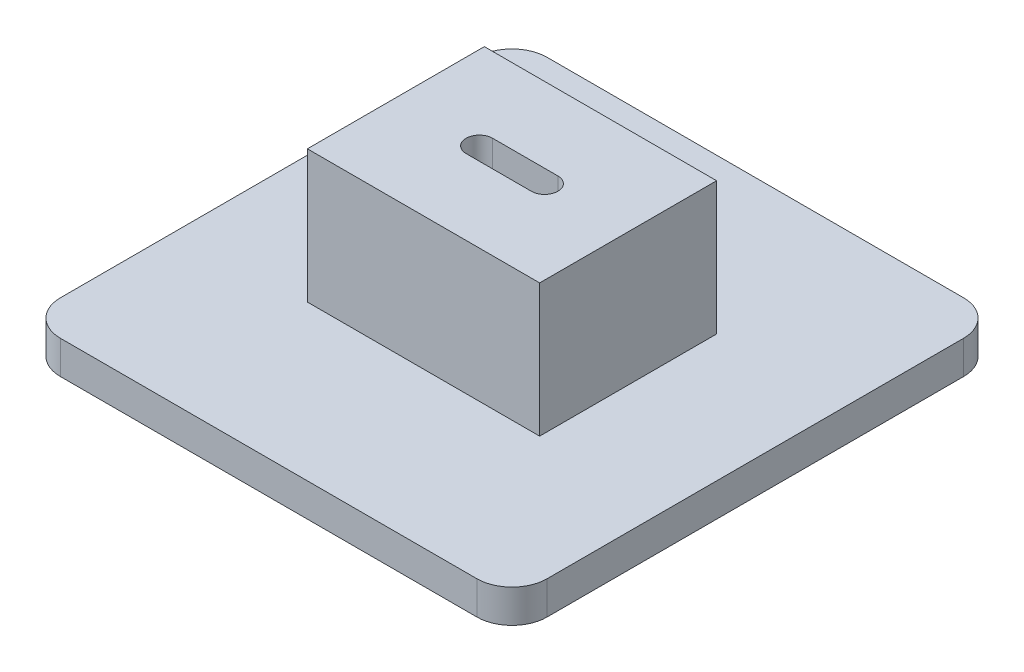
ISO-10303-21;
HEADER;
FILE_DESCRIPTION(('STEP AP214'),'2;1');
FILE_NAME('part.step','',(''),(''),'','','');
FILE_SCHEMA(('AUTOMOTIVE_DESIGN { 1 0 10303 214 1 1 1 1 }'));
ENDSEC;
DATA;
#1=APPLICATION_CONTEXT('core data for automotive mechanical design processes');
#2=APPLICATION_PROTOCOL_DEFINITION('international standard','automotive_design',2000,#1);
#3=PRODUCT_CONTEXT('',#1,'mechanical');
#4=PRODUCT('Part','Part','',(#3));
#5=PRODUCT_RELATED_PRODUCT_CATEGORY('part','',(#4));
#6=PRODUCT_DEFINITION_FORMATION('','',#4);
#7=PRODUCT_DEFINITION_CONTEXT('part definition',#1,'design');
#8=PRODUCT_DEFINITION('design','',#6,#7);
#9=PRODUCT_DEFINITION_SHAPE('','',#8);
#10=(LENGTH_UNIT() NAMED_UNIT(*) SI_UNIT(.MILLI.,.METRE.));
#11=(NAMED_UNIT(*) PLANE_ANGLE_UNIT() SI_UNIT($,.RADIAN.));
#12=(NAMED_UNIT(*) SI_UNIT($,.STERADIAN.) SOLID_ANGLE_UNIT());
#13=UNCERTAINTY_MEASURE_WITH_UNIT(LENGTH_MEASURE(1.E-05),#10,'distance_accuracy_value','');
#14=(GEOMETRIC_REPRESENTATION_CONTEXT(3) GLOBAL_UNCERTAINTY_ASSIGNED_CONTEXT((#13)) GLOBAL_UNIT_ASSIGNED_CONTEXT((#10,
#11,#12)) REPRESENTATION_CONTEXT('',''));
#15=CARTESIAN_POINT('',(0.,0.,0.));
#16=DIRECTION('',(0.,0.,1.));
#17=DIRECTION('',(1.,0.,0.));
#18=AXIS2_PLACEMENT_3D('',#15,#16,#17);
#19=CARTESIAN_POINT('',(0.,12.,0.));
#20=DIRECTION('',(0.,-1.,0.));
#21=DIRECTION('',(0.,0.,-1.));
#22=AXIS2_PLACEMENT_3D('',#19,#20,#21);
#23=PLANE('',#22);
#24=DIRECTION('',(0.,0.,-1.));
#25=VECTOR('',#24,1.);
#26=CARTESIAN_POINT('',(14.5,12.,-17.));
#27=LINE('',#26,#25);
#28=CARTESIAN_POINT('',(14.5,12.,-17.));
#29=VERTEX_POINT('',#28);
#30=CARTESIAN_POINT('',(14.5,12.,-27.));
#31=VERTEX_POINT('',#30);
#32=EDGE_CURVE('E229',#29,#31,#27,.T.);
#33=ORIENTED_EDGE('',*,*,#32,.T.);
#34=DIRECTION('',(1.,0.,0.));
#35=VECTOR('',#34,1.);
#36=CARTESIAN_POINT('',(14.5,12.,-27.));
#37=LINE('',#36,#35);
#38=CARTESIAN_POINT('',(29.5,12.,-27.));
#39=VERTEX_POINT('',#38);
#40=EDGE_CURVE('E233',#31,#39,#37,.T.);
#41=ORIENTED_EDGE('',*,*,#40,.T.);
#42=DIRECTION('',(0.,0.,1.));
#43=VECTOR('',#42,1.);
#44=CARTESIAN_POINT('',(29.5,12.,-17.));
#45=LINE('',#44,#43);
#46=CARTESIAN_POINT('',(29.5,12.,-17.));
#47=VERTEX_POINT('',#46);
#48=EDGE_CURVE('E238',#39,#47,#45,.T.);
#49=ORIENTED_EDGE('',*,*,#48,.T.);
#50=DIRECTION('',(-1.,0.,0.));
#51=VECTOR('',#50,1.);
#52=CARTESIAN_POINT('',(14.5,12.,-17.));
#53=LINE('',#52,#51);
#54=EDGE_CURVE('E242',#47,#29,#53,.T.);
#55=ORIENTED_EDGE('',*,*,#54,.T.);
#56=EDGE_LOOP('',(#33,#41,#49,#55));
#57=FACE_BOUND('',#56,.T.);
#58=DIRECTION('',(-1.,0.,0.));
#59=VECTOR('',#58,1.);
#60=CARTESIAN_POINT('',(19.05,12.,-23.2));
#61=LINE('',#60,#59);
#62=CARTESIAN_POINT('',(24.95,12.,-23.2));
#63=VERTEX_POINT('',#62);
#64=CARTESIAN_POINT('',(19.05,12.,-23.2));
#65=VERTEX_POINT('',#64);
#66=EDGE_CURVE('E202',#63,#65,#61,.T.);
#67=ORIENTED_EDGE('',*,*,#66,.T.);
#68=CARTESIAN_POINT('',(19.05,12.,-22.));
#69=DIRECTION('',(0.,-1.,0.));
#70=DIRECTION('',(0.,0.,-1.));
#71=AXIS2_PLACEMENT_3D('',#68,#69,#70);
#72=CIRCLE('',#71,1.2);
#73=CARTESIAN_POINT('',(19.05,12.,-20.8));
#74=VERTEX_POINT('',#73);
#75=EDGE_CURVE('E194',#65,#74,#72,.F.);
#76=ORIENTED_EDGE('',*,*,#75,.T.);
#77=DIRECTION('',(1.,0.,0.));
#78=VECTOR('',#77,1.);
#79=CARTESIAN_POINT('',(19.05,12.,-20.8));
#80=LINE('',#79,#78);
#81=CARTESIAN_POINT('',(24.95,12.,-20.8));
#82=VERTEX_POINT('',#81);
#83=EDGE_CURVE('E177',#74,#82,#80,.T.);
#84=ORIENTED_EDGE('',*,*,#83,.T.);
#85=CARTESIAN_POINT('',(24.95,12.,-22.));
#86=DIRECTION('',(0.,-1.,0.));
#87=DIRECTION('',(0.,0.,-1.));
#88=AXIS2_PLACEMENT_3D('',#85,#86,#87);
#89=CIRCLE('',#88,1.2);
#90=EDGE_CURVE('E209',#82,#63,#89,.F.);
#91=ORIENTED_EDGE('',*,*,#90,.T.);
#92=EDGE_LOOP('',(#67,#76,#84,#91));
#93=FACE_BOUND('',#92,.T.);
#94=ADVANCED_FACE('F38',(#57,#93),#23,.T.);
#95=CARTESIAN_POINT('',(0.,3.,0.));
#96=DIRECTION('',(0.,-1.,0.));
#97=DIRECTION('',(0.,0.,-1.));
#98=AXIS2_PLACEMENT_3D('',#95,#96,#97);
#99=PLANE('',#98);
#100=DIRECTION('',(0.,0.,-1.));
#101=VECTOR('',#100,1.);
#102=CARTESIAN_POINT('',(44.,3.,0.));
#103=LINE('',#102,#101);
#104=CARTESIAN_POINT('',(44.,3.,-3.175));
#105=VERTEX_POINT('',#104);
#106=CARTESIAN_POINT('',(44.,3.,-40.825));
#107=VERTEX_POINT('',#106);
#108=EDGE_CURVE('E325',#105,#107,#103,.T.);
#109=ORIENTED_EDGE('',*,*,#108,.T.);
#110=CARTESIAN_POINT('',(40.825,3.,-40.825));
#111=DIRECTION('',(0.,-1.,0.));
#112=DIRECTION('',(0.,0.,-1.));
#113=AXIS2_PLACEMENT_3D('',#110,#111,#112);
#114=CIRCLE('',#113,3.175);
#115=CARTESIAN_POINT('',(40.825,3.,-44.));
#116=VERTEX_POINT('',#115);
#117=EDGE_CURVE('E380',#107,#116,#114,.F.);
#118=ORIENTED_EDGE('',*,*,#117,.T.);
#119=DIRECTION('',(-1.,0.,0.));
#120=VECTOR('',#119,1.);
#121=CARTESIAN_POINT('',(0.,3.,-44.));
#122=LINE('',#121,#120);
#123=CARTESIAN_POINT('',(3.175,3.,-44.));
#124=VERTEX_POINT('',#123);
#125=EDGE_CURVE('E329',#116,#124,#122,.T.);
#126=ORIENTED_EDGE('',*,*,#125,.T.);
#127=CARTESIAN_POINT('',(3.175,3.,-40.825));
#128=DIRECTION('',(0.,-1.,0.));
#129=DIRECTION('',(0.,0.,-1.));
#130=AXIS2_PLACEMENT_3D('',#127,#128,#129);
#131=CIRCLE('',#130,3.175);
#132=CARTESIAN_POINT('',(0.,3.,-40.825));
#133=VERTEX_POINT('',#132);
#134=EDGE_CURVE('E372',#124,#133,#131,.F.);
#135=ORIENTED_EDGE('',*,*,#134,.T.);
#136=DIRECTION('',(0.,0.,1.));
#137=VECTOR('',#136,1.);
#138=CARTESIAN_POINT('',(0.,3.,0.));
#139=LINE('',#138,#137);
#140=CARTESIAN_POINT('',(0.,3.,-3.175));
#141=VERTEX_POINT('',#140);
#142=EDGE_CURVE('E318',#133,#141,#139,.T.);
#143=ORIENTED_EDGE('',*,*,#142,.T.);
#144=CARTESIAN_POINT('',(3.175,3.,-3.175));
#145=DIRECTION('',(0.,-1.,0.));
#146=DIRECTION('',(0.,0.,-1.));
#147=AXIS2_PLACEMENT_3D('',#144,#145,#146);
#148=CIRCLE('',#147,3.175);
#149=CARTESIAN_POINT('',(3.175,3.,0.));
#150=VERTEX_POINT('',#149);
#151=EDGE_CURVE('E61',#141,#150,#148,.F.);
#152=ORIENTED_EDGE('',*,*,#151,.T.);
#153=DIRECTION('',(1.,0.,0.));
#154=VECTOR('',#153,1.);
#155=CARTESIAN_POINT('',(0.,3.,0.));
#156=LINE('',#155,#154);
#157=CARTESIAN_POINT('',(40.825,3.,0.));
#158=VERTEX_POINT('',#157);
#159=EDGE_CURVE('E321',#150,#158,#156,.T.);
#160=ORIENTED_EDGE('',*,*,#159,.T.);
#161=CARTESIAN_POINT('',(40.825,3.,-3.175));
#162=DIRECTION('',(0.,-1.,0.));
#163=DIRECTION('',(0.,0.,-1.));
#164=AXIS2_PLACEMENT_3D('',#161,#162,#163);
#165=CIRCLE('',#164,3.175);
#166=EDGE_CURVE('E377',#158,#105,#165,.F.);
#167=ORIENTED_EDGE('',*,*,#166,.T.);
#168=EDGE_LOOP('',(#109,#118,#126,#135,#143,#152,#160,#167));
#169=FACE_BOUND('',#168,.T.);
#170=DIRECTION('',(0.,0.,1.));
#171=VECTOR('',#170,1.);
#172=CARTESIAN_POINT('',(11.5,3.,-30.));
#173=LINE('',#172,#171);
#174=CARTESIAN_POINT('',(11.5,3.,-30.));
#175=VERTEX_POINT('',#174);
#176=CARTESIAN_POINT('',(11.5,3.,-14.));
#177=VERTEX_POINT('',#176);
#178=EDGE_CURVE('E263',#175,#177,#173,.T.);
#179=ORIENTED_EDGE('',*,*,#178,.F.);
#180=DIRECTION('',(-1.,0.,0.));
#181=VECTOR('',#180,1.);
#182=CARTESIAN_POINT('',(11.5,3.,-30.));
#183=LINE('',#182,#181);
#184=CARTESIAN_POINT('',(32.5,3.,-30.));
#185=VERTEX_POINT('',#184);
#186=EDGE_CURVE('E278',#185,#175,#183,.T.);
#187=ORIENTED_EDGE('',*,*,#186,.F.);
#188=DIRECTION('',(0.,0.,-1.));
#189=VECTOR('',#188,1.);
#190=CARTESIAN_POINT('',(32.5,3.,-30.));
#191=LINE('',#190,#189);
#192=CARTESIAN_POINT('',(32.5,3.,-14.));
#193=VERTEX_POINT('',#192);
#194=EDGE_CURVE('E295',#193,#185,#191,.T.);
#195=ORIENTED_EDGE('',*,*,#194,.F.);
#196=DIRECTION('',(1.,0.,0.));
#197=VECTOR('',#196,1.);
#198=CARTESIAN_POINT('',(11.5,3.,-14.));
#199=LINE('',#198,#197);
#200=EDGE_CURVE('E291',#177,#193,#199,.T.);
#201=ORIENTED_EDGE('',*,*,#200,.F.);
#202=EDGE_LOOP('',(#179,#187,#195,#201));
#203=FACE_BOUND('',#202,.T.);
#204=ADVANCED_FACE('F407',(#169,#203),#99,.F.);
#205=CARTESIAN_POINT('',(0.,3.,0.));
#206=DIRECTION('',(1.,0.,0.));
#207=DIRECTION('',(0.,0.,-1.));
#208=AXIS2_PLACEMENT_3D('',#205,#206,#207);
#209=PLANE('',#208);
#210=DIRECTION('',(0.,0.,1.));
#211=VECTOR('',#210,1.);
#212=CARTESIAN_POINT('',(0.,0.,0.));
#213=LINE('',#212,#211);
#214=CARTESIAN_POINT('',(0.,0.,-40.825));
#215=VERTEX_POINT('',#214);
#216=CARTESIAN_POINT('',(0.,0.,-3.175));
#217=VERTEX_POINT('',#216);
#218=EDGE_CURVE('E317',#215,#217,#213,.T.);
#219=ORIENTED_EDGE('',*,*,#218,.T.);
#220=DIRECTION('',(0.,-1.,0.));
#221=VECTOR('',#220,1.);
#222=CARTESIAN_POINT('',(0.,3.,-3.175));
#223=LINE('',#222,#221);
#224=EDGE_CURVE('E11',#217,#141,#223,.F.);
#225=ORIENTED_EDGE('',*,*,#224,.T.);
#226=ORIENTED_EDGE('',*,*,#142,.F.);
#227=DIRECTION('',(0.,-1.,0.));
#228=VECTOR('',#227,1.);
#229=CARTESIAN_POINT('',(0.,3.,-40.825));
#230=LINE('',#229,#228);
#231=EDGE_CURVE('E47',#133,#215,#230,.T.);
#232=ORIENTED_EDGE('',*,*,#231,.T.);
#233=EDGE_LOOP('',(#219,#225,#226,#232));
#234=FACE_BOUND('',#233,.T.);
#235=ADVANCED_FACE('F394',(#234),#209,.F.);
#236=CARTESIAN_POINT('',(0.,3.,0.));
#237=DIRECTION('',(0.,0.,-1.));
#238=DIRECTION('',(-1.,0.,0.));
#239=AXIS2_PLACEMENT_3D('',#236,#237,#238);
#240=PLANE('',#239);
#241=DIRECTION('',(1.,0.,0.));
#242=VECTOR('',#241,1.);
#243=CARTESIAN_POINT('',(0.,0.,0.));
#244=LINE('',#243,#242);
#245=CARTESIAN_POINT('',(3.175,0.,0.));
#246=VERTEX_POINT('',#245);
#247=CARTESIAN_POINT('',(40.825,0.,0.));
#248=VERTEX_POINT('',#247);
#249=EDGE_CURVE('E337',#246,#248,#244,.T.);
#250=ORIENTED_EDGE('',*,*,#249,.T.);
#251=DIRECTION('',(0.,-1.,0.));
#252=VECTOR('',#251,1.);
#253=CARTESIAN_POINT('',(40.825,3.,0.));
#254=LINE('',#253,#252);
#255=EDGE_CURVE('E54',#248,#158,#254,.F.);
#256=ORIENTED_EDGE('',*,*,#255,.T.);
#257=ORIENTED_EDGE('',*,*,#159,.F.);
#258=DIRECTION('',(0.,-1.,0.));
#259=VECTOR('',#258,1.);
#260=CARTESIAN_POINT('',(3.175,3.,0.));
#261=LINE('',#260,#259);
#262=EDGE_CURVE('E383',#150,#246,#261,.T.);
#263=ORIENTED_EDGE('',*,*,#262,.T.);
#264=EDGE_LOOP('',(#250,#256,#257,#263));
#265=FACE_BOUND('',#264,.T.);
#266=ADVANCED_FACE('F405',(#265),#240,.F.);
#267=CARTESIAN_POINT('',(44.,3.,0.));
#268=DIRECTION('',(-1.,0.,0.));
#269=DIRECTION('',(0.,0.,1.));
#270=AXIS2_PLACEMENT_3D('',#267,#268,#269);
#271=PLANE('',#270);
#272=DIRECTION('',(0.,0.,-1.));
#273=VECTOR('',#272,1.);
#274=CARTESIAN_POINT('',(44.,0.,0.));
#275=LINE('',#274,#273);
#276=CARTESIAN_POINT('',(44.,0.,-3.175));
#277=VERTEX_POINT('',#276);
#278=CARTESIAN_POINT('',(44.,0.,-40.825));
#279=VERTEX_POINT('',#278);
#280=EDGE_CURVE('E340',#277,#279,#275,.T.);
#281=ORIENTED_EDGE('',*,*,#280,.T.);
#282=DIRECTION('',(0.,-1.,0.));
#283=VECTOR('',#282,1.);
#284=CARTESIAN_POINT('',(44.,3.,-40.825));
#285=LINE('',#284,#283);
#286=EDGE_CURVE('E369',#279,#107,#285,.F.);
#287=ORIENTED_EDGE('',*,*,#286,.T.);
#288=ORIENTED_EDGE('',*,*,#108,.F.);
#289=DIRECTION('',(0.,-1.,0.));
#290=VECTOR('',#289,1.);
#291=CARTESIAN_POINT('',(44.,3.,-3.175));
#292=LINE('',#291,#290);
#293=EDGE_CURVE('E365',#105,#277,#292,.T.);
#294=ORIENTED_EDGE('',*,*,#293,.T.);
#295=EDGE_LOOP('',(#281,#287,#288,#294));
#296=FACE_BOUND('',#295,.T.);
#297=ADVANCED_FACE('F415',(#296),#271,.F.);
#298=CARTESIAN_POINT('',(0.,3.,-44.));
#299=DIRECTION('',(0.,0.,1.));
#300=DIRECTION('',(1.,0.,0.));
#301=AXIS2_PLACEMENT_3D('',#298,#299,#300);
#302=PLANE('',#301);
#303=ORIENTED_EDGE('',*,*,#125,.F.);
#304=DIRECTION('',(0.,-1.,0.));
#305=VECTOR('',#304,1.);
#306=CARTESIAN_POINT('',(40.825,3.,-44.));
#307=LINE('',#306,#305);
#308=CARTESIAN_POINT('',(40.825,0.,-44.));
#309=VERTEX_POINT('',#308);
#310=EDGE_CURVE('E349',#116,#309,#307,.T.);
#311=ORIENTED_EDGE('',*,*,#310,.T.);
#312=DIRECTION('',(-1.,0.,0.));
#313=VECTOR('',#312,1.);
#314=CARTESIAN_POINT('',(0.,0.,-44.));
#315=LINE('',#314,#313);
#316=CARTESIAN_POINT('',(3.175,0.,-44.));
#317=VERTEX_POINT('',#316);
#318=EDGE_CURVE('E322',#309,#317,#315,.T.);
#319=ORIENTED_EDGE('',*,*,#318,.T.);
#320=DIRECTION('',(0.,-1.,0.));
#321=VECTOR('',#320,1.);
#322=CARTESIAN_POINT('',(3.175,3.,-44.));
#323=LINE('',#322,#321);
#324=EDGE_CURVE('E333',#317,#124,#323,.F.);
#325=ORIENTED_EDGE('',*,*,#324,.T.);
#326=EDGE_LOOP('',(#303,#311,#319,#325));
#327=FACE_BOUND('',#326,.T.);
#328=ADVANCED_FACE('F423',(#327),#302,.F.);
#329=CARTESIAN_POINT('',(0.,0.,0.));
#330=DIRECTION('',(0.,-1.,0.));
#331=DIRECTION('',(0.,0.,-1.));
#332=AXIS2_PLACEMENT_3D('',#329,#330,#331);
#333=PLANE('',#332);
#334=DIRECTION('',(0.,0.,-1.));
#335=VECTOR('',#334,1.);
#336=CARTESIAN_POINT('',(14.5,0.,-17.));
#337=LINE('',#336,#335);
#338=CARTESIAN_POINT('',(14.5,0.,-17.));
#339=VERTEX_POINT('',#338);
#340=CARTESIAN_POINT('',(14.5,0.,-27.));
#341=VERTEX_POINT('',#340);
#342=EDGE_CURVE('E189',#339,#341,#337,.T.);
#343=ORIENTED_EDGE('',*,*,#342,.F.);
#344=DIRECTION('',(-1.,0.,0.));
#345=VECTOR('',#344,1.);
#346=CARTESIAN_POINT('',(14.5,0.,-17.));
#347=LINE('',#346,#345);
#348=CARTESIAN_POINT('',(29.5,0.,-17.));
#349=VERTEX_POINT('',#348);
#350=EDGE_CURVE('E234',#349,#339,#347,.T.);
#351=ORIENTED_EDGE('',*,*,#350,.F.);
#352=DIRECTION('',(0.,0.,1.));
#353=VECTOR('',#352,1.);
#354=CARTESIAN_POINT('',(29.5,0.,-17.));
#355=LINE('',#354,#353);
#356=CARTESIAN_POINT('',(29.5,0.,-27.));
#357=VERTEX_POINT('',#356);
#358=EDGE_CURVE('E253',#357,#349,#355,.T.);
#359=ORIENTED_EDGE('',*,*,#358,.F.);
#360=DIRECTION('',(1.,0.,0.));
#361=VECTOR('',#360,1.);
#362=CARTESIAN_POINT('',(14.5,0.,-27.));
#363=LINE('',#362,#361);
#364=EDGE_CURVE('E249',#341,#357,#363,.T.);
#365=ORIENTED_EDGE('',*,*,#364,.F.);
#366=EDGE_LOOP('',(#343,#351,#359,#365));
#367=FACE_BOUND('',#366,.T.);
#368=ORIENTED_EDGE('',*,*,#318,.F.);
#369=CARTESIAN_POINT('',(40.825,0.,-40.825));
#370=DIRECTION('',(0.,-1.,0.));
#371=DIRECTION('',(0.,0.,-1.));
#372=AXIS2_PLACEMENT_3D('',#369,#370,#371);
#373=CIRCLE('',#372,3.175);
#374=EDGE_CURVE('E362',#309,#279,#373,.T.);
#375=ORIENTED_EDGE('',*,*,#374,.T.);
#376=ORIENTED_EDGE('',*,*,#280,.F.);
#377=CARTESIAN_POINT('',(40.825,0.,-3.175));
#378=DIRECTION('',(0.,-1.,0.));
#379=DIRECTION('',(0.,0.,-1.));
#380=AXIS2_PLACEMENT_3D('',#377,#378,#379);
#381=CIRCLE('',#380,3.175);
#382=EDGE_CURVE('E359',#277,#248,#381,.T.);
#383=ORIENTED_EDGE('',*,*,#382,.T.);
#384=ORIENTED_EDGE('',*,*,#249,.F.);
#385=CARTESIAN_POINT('',(3.175,0.,-3.175));
#386=DIRECTION('',(0.,-1.,0.));
#387=DIRECTION('',(0.,0.,-1.));
#388=AXIS2_PLACEMENT_3D('',#385,#386,#387);
#389=CIRCLE('',#388,3.175);
#390=EDGE_CURVE('E356',#246,#217,#389,.T.);
#391=ORIENTED_EDGE('',*,*,#390,.T.);
#392=ORIENTED_EDGE('',*,*,#218,.F.);
#393=CARTESIAN_POINT('',(3.175,0.,-40.825));
#394=DIRECTION('',(0.,-1.,0.));
#395=DIRECTION('',(0.,0.,-1.));
#396=AXIS2_PLACEMENT_3D('',#393,#394,#395);
#397=CIRCLE('',#396,3.175);
#398=EDGE_CURVE('E353',#215,#317,#397,.T.);
#399=ORIENTED_EDGE('',*,*,#398,.T.);
#400=EDGE_LOOP('',(#368,#375,#376,#383,#384,#391,#392,#399));
#401=FACE_BOUND('',#400,.T.);
#402=ADVANCED_FACE('F400',(#367,#401),#333,.T.);
#403=CARTESIAN_POINT('',(11.5,15.,-30.));
#404=DIRECTION('',(1.,0.,0.));
#405=DIRECTION('',(0.,0.,-1.));
#406=AXIS2_PLACEMENT_3D('',#403,#404,#405);
#407=PLANE('',#406);
#408=ORIENTED_EDGE('',*,*,#178,.T.);
#409=DIRECTION('',(0.,-1.,0.));
#410=VECTOR('',#409,1.);
#411=CARTESIAN_POINT('',(11.5,15.,-14.));
#412=LINE('',#411,#410);
#413=CARTESIAN_POINT('',(11.5,15.,-14.));
#414=VERTEX_POINT('',#413);
#415=EDGE_CURVE('E313',#414,#177,#412,.T.);
#416=ORIENTED_EDGE('',*,*,#415,.F.);
#417=DIRECTION('',(0.,0.,1.));
#418=VECTOR('',#417,1.);
#419=CARTESIAN_POINT('',(11.5,15.,-30.));
#420=LINE('',#419,#418);
#421=CARTESIAN_POINT('',(11.5,15.,-30.));
#422=VERTEX_POINT('',#421);
#423=EDGE_CURVE('E273',#422,#414,#420,.T.);
#424=ORIENTED_EDGE('',*,*,#423,.F.);
#425=DIRECTION('',(0.,-1.,0.));
#426=VECTOR('',#425,1.);
#427=CARTESIAN_POINT('',(11.5,15.,-30.));
#428=LINE('',#427,#426);
#429=EDGE_CURVE('E287',#422,#175,#428,.T.);
#430=ORIENTED_EDGE('',*,*,#429,.T.);
#431=EDGE_LOOP('',(#408,#416,#424,#430));
#432=FACE_BOUND('',#431,.T.);
#433=ADVANCED_FACE('F471',(#432),#407,.F.);
#434=CARTESIAN_POINT('',(11.5,15.,-14.));
#435=DIRECTION('',(0.,0.,-1.));
#436=DIRECTION('',(-1.,0.,0.));
#437=AXIS2_PLACEMENT_3D('',#434,#435,#436);
#438=PLANE('',#437);
#439=ORIENTED_EDGE('',*,*,#200,.T.);
#440=DIRECTION('',(0.,-1.,0.));
#441=VECTOR('',#440,1.);
#442=CARTESIAN_POINT('',(32.5,15.,-14.));
#443=LINE('',#442,#441);
#444=CARTESIAN_POINT('',(32.5,15.,-14.));
#445=VERTEX_POINT('',#444);
#446=EDGE_CURVE('E309',#445,#193,#443,.T.);
#447=ORIENTED_EDGE('',*,*,#446,.F.);
#448=DIRECTION('',(1.,0.,0.));
#449=VECTOR('',#448,1.);
#450=CARTESIAN_POINT('',(11.5,15.,-14.));
#451=LINE('',#450,#449);
#452=EDGE_CURVE('E277',#414,#445,#451,.T.);
#453=ORIENTED_EDGE('',*,*,#452,.F.);
#454=ORIENTED_EDGE('',*,*,#415,.T.);
#455=EDGE_LOOP('',(#439,#447,#453,#454));
#456=FACE_BOUND('',#455,.T.);
#457=ADVANCED_FACE('F467',(#456),#438,.F.);
#458=CARTESIAN_POINT('',(32.5,15.,-30.));
#459=DIRECTION('',(-1.,0.,0.));
#460=DIRECTION('',(0.,0.,1.));
#461=AXIS2_PLACEMENT_3D('',#458,#459,#460);
#462=PLANE('',#461);
#463=ORIENTED_EDGE('',*,*,#194,.T.);
#464=DIRECTION('',(0.,-1.,0.));
#465=VECTOR('',#464,1.);
#466=CARTESIAN_POINT('',(32.5,15.,-30.));
#467=LINE('',#466,#465);
#468=CARTESIAN_POINT('',(32.5,15.,-30.));
#469=VERTEX_POINT('',#468);
#470=EDGE_CURVE('E305',#469,#185,#467,.T.);
#471=ORIENTED_EDGE('',*,*,#470,.F.);
#472=DIRECTION('',(0.,0.,-1.));
#473=VECTOR('',#472,1.);
#474=CARTESIAN_POINT('',(32.5,15.,-30.));
#475=LINE('',#474,#473);
#476=EDGE_CURVE('E281',#445,#469,#475,.T.);
#477=ORIENTED_EDGE('',*,*,#476,.F.);
#478=ORIENTED_EDGE('',*,*,#446,.T.);
#479=EDGE_LOOP('',(#463,#471,#477,#478));
#480=FACE_BOUND('',#479,.T.);
#481=ADVANCED_FACE('F463',(#480),#462,.F.);
#482=CARTESIAN_POINT('',(11.5,15.,-30.));
#483=DIRECTION('',(0.,0.,1.));
#484=DIRECTION('',(1.,0.,0.));
#485=AXIS2_PLACEMENT_3D('',#482,#483,#484);
#486=PLANE('',#485);
#487=ORIENTED_EDGE('',*,*,#186,.T.);
#488=ORIENTED_EDGE('',*,*,#429,.F.);
#489=DIRECTION('',(-1.,0.,0.));
#490=VECTOR('',#489,1.);
#491=CARTESIAN_POINT('',(11.5,15.,-30.));
#492=LINE('',#491,#490);
#493=EDGE_CURVE('E284',#469,#422,#492,.T.);
#494=ORIENTED_EDGE('',*,*,#493,.F.);
#495=ORIENTED_EDGE('',*,*,#470,.T.);
#496=EDGE_LOOP('',(#487,#488,#494,#495));
#497=FACE_BOUND('',#496,.T.);
#498=ADVANCED_FACE('F459',(#497),#486,.F.);
#499=CARTESIAN_POINT('',(0.,15.,0.));
#500=DIRECTION('',(0.,1.,0.));
#501=DIRECTION('',(0.,0.,1.));
#502=AXIS2_PLACEMENT_3D('',#499,#500,#501);
#503=PLANE('',#502);
#504=CARTESIAN_POINT('',(19.05,15.,-22.));
#505=DIRECTION('',(0.,1.,0.));
#506=DIRECTION('',(0.,0.,1.));
#507=AXIS2_PLACEMENT_3D('',#504,#505,#506);
#508=CIRCLE('',#507,1.2);
#509=CARTESIAN_POINT('',(19.05,15.,-23.2));
#510=VERTEX_POINT('',#509);
#511=CARTESIAN_POINT('',(19.05,15.,-20.8));
#512=VERTEX_POINT('',#511);
#513=EDGE_CURVE('E197',#510,#512,#508,.T.);
#514=ORIENTED_EDGE('',*,*,#513,.F.);
#515=DIRECTION('',(-1.,0.,0.));
#516=VECTOR('',#515,1.);
#517=CARTESIAN_POINT('',(19.05,15.,-23.2));
#518=LINE('',#517,#516);
#519=CARTESIAN_POINT('',(24.95,15.,-23.2));
#520=VERTEX_POINT('',#519);
#521=EDGE_CURVE('E199',#520,#510,#518,.T.);
#522=ORIENTED_EDGE('',*,*,#521,.F.);
#523=CARTESIAN_POINT('',(24.95,15.,-22.));
#524=DIRECTION('',(0.,1.,0.));
#525=DIRECTION('',(0.,0.,1.));
#526=AXIS2_PLACEMENT_3D('',#523,#524,#525);
#527=CIRCLE('',#526,1.2);
#528=CARTESIAN_POINT('',(24.95,15.,-20.8));
#529=VERTEX_POINT('',#528);
#530=EDGE_CURVE('E215',#529,#520,#527,.T.);
#531=ORIENTED_EDGE('',*,*,#530,.F.);
#532=DIRECTION('',(1.,0.,0.));
#533=VECTOR('',#532,1.);
#534=CARTESIAN_POINT('',(19.05,15.,-20.8));
#535=LINE('',#534,#533);
#536=EDGE_CURVE('E207',#512,#529,#535,.T.);
#537=ORIENTED_EDGE('',*,*,#536,.F.);
#538=EDGE_LOOP('',(#514,#522,#531,#537));
#539=FACE_BOUND('',#538,.T.);
#540=ORIENTED_EDGE('',*,*,#423,.T.);
#541=ORIENTED_EDGE('',*,*,#452,.T.);
#542=ORIENTED_EDGE('',*,*,#476,.T.);
#543=ORIENTED_EDGE('',*,*,#493,.T.);
#544=EDGE_LOOP('',(#540,#541,#542,#543));
#545=FACE_BOUND('',#544,.T.);
#546=ADVANCED_FACE('F455',(#539,#545),#503,.T.);
#547=CARTESIAN_POINT('',(14.5,12.,-17.));
#548=DIRECTION('',(-1.,0.,0.));
#549=DIRECTION('',(0.,0.,1.));
#550=AXIS2_PLACEMENT_3D('',#547,#548,#549);
#551=PLANE('',#550);
#552=ORIENTED_EDGE('',*,*,#342,.T.);
#553=DIRECTION('',(0.,-1.,0.));
#554=VECTOR('',#553,1.);
#555=CARTESIAN_POINT('',(14.5,12.,-27.));
#556=LINE('',#555,#554);
#557=EDGE_CURVE('E246',#31,#341,#556,.T.);
#558=ORIENTED_EDGE('',*,*,#557,.F.);
#559=ORIENTED_EDGE('',*,*,#32,.F.);
#560=DIRECTION('',(0.,-1.,0.));
#561=VECTOR('',#560,1.);
#562=CARTESIAN_POINT('',(14.5,12.,-17.));
#563=LINE('',#562,#561);
#564=EDGE_CURVE('E260',#29,#339,#563,.T.);
#565=ORIENTED_EDGE('',*,*,#564,.T.);
#566=EDGE_LOOP('',(#552,#558,#559,#565));
#567=FACE_BOUND('',#566,.T.);
#568=ADVANCED_FACE('F445',(#567),#551,.F.);
#569=CARTESIAN_POINT('',(14.5,12.,-17.));
#570=DIRECTION('',(0.,0.,1.));
#571=DIRECTION('',(1.,0.,0.));
#572=AXIS2_PLACEMENT_3D('',#569,#570,#571);
#573=PLANE('',#572);
#574=ORIENTED_EDGE('',*,*,#350,.T.);
#575=ORIENTED_EDGE('',*,*,#564,.F.);
#576=ORIENTED_EDGE('',*,*,#54,.F.);
#577=DIRECTION('',(0.,-1.,0.));
#578=VECTOR('',#577,1.);
#579=CARTESIAN_POINT('',(29.5,12.,-17.));
#580=LINE('',#579,#578);
#581=EDGE_CURVE('E264',#47,#349,#580,.T.);
#582=ORIENTED_EDGE('',*,*,#581,.T.);
#583=EDGE_LOOP('',(#574,#575,#576,#582));
#584=FACE_BOUND('',#583,.T.);
#585=ADVANCED_FACE('F441',(#584),#573,.F.);
#586=CARTESIAN_POINT('',(29.5,12.,-17.));
#587=DIRECTION('',(1.,0.,0.));
#588=DIRECTION('',(0.,0.,-1.));
#589=AXIS2_PLACEMENT_3D('',#586,#587,#588);
#590=PLANE('',#589);
#591=ORIENTED_EDGE('',*,*,#358,.T.);
#592=ORIENTED_EDGE('',*,*,#581,.F.);
#593=ORIENTED_EDGE('',*,*,#48,.F.);
#594=DIRECTION('',(0.,-1.,0.));
#595=VECTOR('',#594,1.);
#596=CARTESIAN_POINT('',(29.5,12.,-27.));
#597=LINE('',#596,#595);
#598=EDGE_CURVE('E267',#39,#357,#597,.T.);
#599=ORIENTED_EDGE('',*,*,#598,.T.);
#600=EDGE_LOOP('',(#591,#592,#593,#599));
#601=FACE_BOUND('',#600,.T.);
#602=ADVANCED_FACE('F444',(#601),#590,.F.);
#603=CARTESIAN_POINT('',(14.5,12.,-27.));
#604=DIRECTION('',(0.,0.,-1.));
#605=DIRECTION('',(-1.,0.,0.));
#606=AXIS2_PLACEMENT_3D('',#603,#604,#605);
#607=PLANE('',#606);
#608=ORIENTED_EDGE('',*,*,#364,.T.);
#609=ORIENTED_EDGE('',*,*,#598,.F.);
#610=ORIENTED_EDGE('',*,*,#40,.F.);
#611=ORIENTED_EDGE('',*,*,#557,.T.);
#612=EDGE_LOOP('',(#608,#609,#610,#611));
#613=FACE_BOUND('',#612,.T.);
#614=ADVANCED_FACE('F449',(#613),#607,.F.);
#615=CARTESIAN_POINT('',(19.05,-0.000999999999999265,-22.));
#616=DIRECTION('',(0.,1.,0.));
#617=DIRECTION('',(0.,0.,1.));
#618=AXIS2_PLACEMENT_3D('',#615,#616,#617);
#619=CYLINDRICAL_SURFACE('',#618,1.2);
#620=DIRECTION('',(0.,1.,0.));
#621=VECTOR('',#620,1.);
#622=CARTESIAN_POINT('',(19.05,-0.000999999999999265,-23.2));
#623=LINE('',#622,#621);
#624=EDGE_CURVE('E190',#65,#510,#623,.T.);
#625=ORIENTED_EDGE('',*,*,#624,.T.);
#626=ORIENTED_EDGE('',*,*,#513,.T.);
#627=DIRECTION('',(0.,1.,0.));
#628=VECTOR('',#627,1.);
#629=CARTESIAN_POINT('',(19.05,-0.000999999999999265,-20.8));
#630=LINE('',#629,#628);
#631=EDGE_CURVE('E181',#74,#512,#630,.T.);
#632=ORIENTED_EDGE('',*,*,#631,.F.);
#633=ORIENTED_EDGE('',*,*,#75,.F.);
#634=EDGE_LOOP('',(#625,#626,#632,#633));
#635=FACE_BOUND('',#634,.T.);
#636=ADVANCED_FACE('F193',(#635),#619,.F.);
#637=CARTESIAN_POINT('',(19.05,-0.000999999999999265,-23.2));
#638=DIRECTION('',(0.,0.,-1.));
#639=DIRECTION('',(-1.,0.,0.));
#640=AXIS2_PLACEMENT_3D('',#637,#638,#639);
#641=PLANE('',#640);
#642=DIRECTION('',(0.,1.,0.));
#643=VECTOR('',#642,1.);
#644=CARTESIAN_POINT('',(24.95,-0.000999999999999265,-23.2));
#645=LINE('',#644,#643);
#646=EDGE_CURVE('E224',#63,#520,#645,.T.);
#647=ORIENTED_EDGE('',*,*,#646,.T.);
#648=ORIENTED_EDGE('',*,*,#521,.T.);
#649=ORIENTED_EDGE('',*,*,#624,.F.);
#650=ORIENTED_EDGE('',*,*,#66,.F.);
#651=EDGE_LOOP('',(#647,#648,#649,#650));
#652=FACE_BOUND('',#651,.T.);
#653=ADVANCED_FACE('F525',(#652),#641,.F.);
#654=CARTESIAN_POINT('',(24.95,-0.000999999999999265,-22.));
#655=DIRECTION('',(0.,1.,0.));
#656=DIRECTION('',(0.,0.,1.));
#657=AXIS2_PLACEMENT_3D('',#654,#655,#656);
#658=CYLINDRICAL_SURFACE('',#657,1.2);
#659=DIRECTION('',(0.,1.,0.));
#660=VECTOR('',#659,1.);
#661=CARTESIAN_POINT('',(24.95,-0.000999999999999265,-20.8));
#662=LINE('',#661,#660);
#663=EDGE_CURVE('E183',#82,#529,#662,.T.);
#664=ORIENTED_EDGE('',*,*,#663,.T.);
#665=ORIENTED_EDGE('',*,*,#530,.T.);
#666=ORIENTED_EDGE('',*,*,#646,.F.);
#667=ORIENTED_EDGE('',*,*,#90,.F.);
#668=EDGE_LOOP('',(#664,#665,#666,#667));
#669=FACE_BOUND('',#668,.T.);
#670=ADVANCED_FACE('F518',(#669),#658,.F.);
#671=CARTESIAN_POINT('',(19.05,-0.000999999999999265,-20.8));
#672=DIRECTION('',(0.,0.,1.));
#673=DIRECTION('',(1.,0.,0.));
#674=AXIS2_PLACEMENT_3D('',#671,#672,#673);
#675=PLANE('',#674);
#676=ORIENTED_EDGE('',*,*,#631,.T.);
#677=ORIENTED_EDGE('',*,*,#536,.T.);
#678=ORIENTED_EDGE('',*,*,#663,.F.);
#679=ORIENTED_EDGE('',*,*,#83,.F.);
#680=EDGE_LOOP('',(#676,#677,#678,#679));
#681=FACE_BOUND('',#680,.T.);
#682=ADVANCED_FACE('F179',(#681),#675,.F.);
#683=CARTESIAN_POINT('',(40.825,3.,-40.825));
#684=DIRECTION('',(0.,-1.,0.));
#685=DIRECTION('',(0.,0.,-1.));
#686=AXIS2_PLACEMENT_3D('',#683,#684,#685);
#687=CYLINDRICAL_SURFACE('',#686,3.175);
#688=ORIENTED_EDGE('',*,*,#117,.F.);
#689=ORIENTED_EDGE('',*,*,#286,.F.);
#690=ORIENTED_EDGE('',*,*,#374,.F.);
#691=ORIENTED_EDGE('',*,*,#310,.F.);
#692=EDGE_LOOP('',(#688,#689,#690,#691));
#693=FACE_BOUND('',#692,.T.);
#694=ADVANCED_FACE('F420',(#693),#687,.T.);
#695=CARTESIAN_POINT('',(40.825,3.,-3.175));
#696=DIRECTION('',(0.,-1.,0.));
#697=DIRECTION('',(0.,0.,-1.));
#698=AXIS2_PLACEMENT_3D('',#695,#696,#697);
#699=CYLINDRICAL_SURFACE('',#698,3.175);
#700=ORIENTED_EDGE('',*,*,#166,.F.);
#701=ORIENTED_EDGE('',*,*,#255,.F.);
#702=ORIENTED_EDGE('',*,*,#382,.F.);
#703=ORIENTED_EDGE('',*,*,#293,.F.);
#704=EDGE_LOOP('',(#700,#701,#702,#703));
#705=FACE_BOUND('',#704,.T.);
#706=ADVANCED_FACE('F412',(#705),#699,.T.);
#707=CARTESIAN_POINT('',(3.175,3.,-3.175));
#708=DIRECTION('',(0.,-1.,0.));
#709=DIRECTION('',(0.,0.,-1.));
#710=AXIS2_PLACEMENT_3D('',#707,#708,#709);
#711=CYLINDRICAL_SURFACE('',#710,3.175);
#712=ORIENTED_EDGE('',*,*,#151,.F.);
#713=ORIENTED_EDGE('',*,*,#224,.F.);
#714=ORIENTED_EDGE('',*,*,#390,.F.);
#715=ORIENTED_EDGE('',*,*,#262,.F.);
#716=EDGE_LOOP('',(#712,#713,#714,#715));
#717=FACE_BOUND('',#716,.T.);
#718=ADVANCED_FACE('F404',(#717),#711,.T.);
#719=CARTESIAN_POINT('',(3.175,3.,-40.825));
#720=DIRECTION('',(0.,-1.,0.));
#721=DIRECTION('',(0.,0.,-1.));
#722=AXIS2_PLACEMENT_3D('',#719,#720,#721);
#723=CYLINDRICAL_SURFACE('',#722,3.175);
#724=ORIENTED_EDGE('',*,*,#134,.F.);
#725=ORIENTED_EDGE('',*,*,#324,.F.);
#726=ORIENTED_EDGE('',*,*,#398,.F.);
#727=ORIENTED_EDGE('',*,*,#231,.F.);
#728=EDGE_LOOP('',(#724,#725,#726,#727));
#729=FACE_BOUND('',#728,.T.);
#730=ADVANCED_FACE('F40',(#729),#723,.T.);
#731=CLOSED_SHELL('',(#94,#204,#235,#266,#297,#328,#402,#433,#457,#481,#498,#546,#568,#585,#602,
#614,#636,#653,#670,#682,#694,#706,#718,#730));
#732=MANIFOLD_SOLID_BREP('B2',#731);
#733=ADVANCED_BREP_SHAPE_REPRESENTATION('',(#18,#732),#14);
#734=SHAPE_DEFINITION_REPRESENTATION(#9,#733);
ENDSEC;
END-ISO-10303-21;
